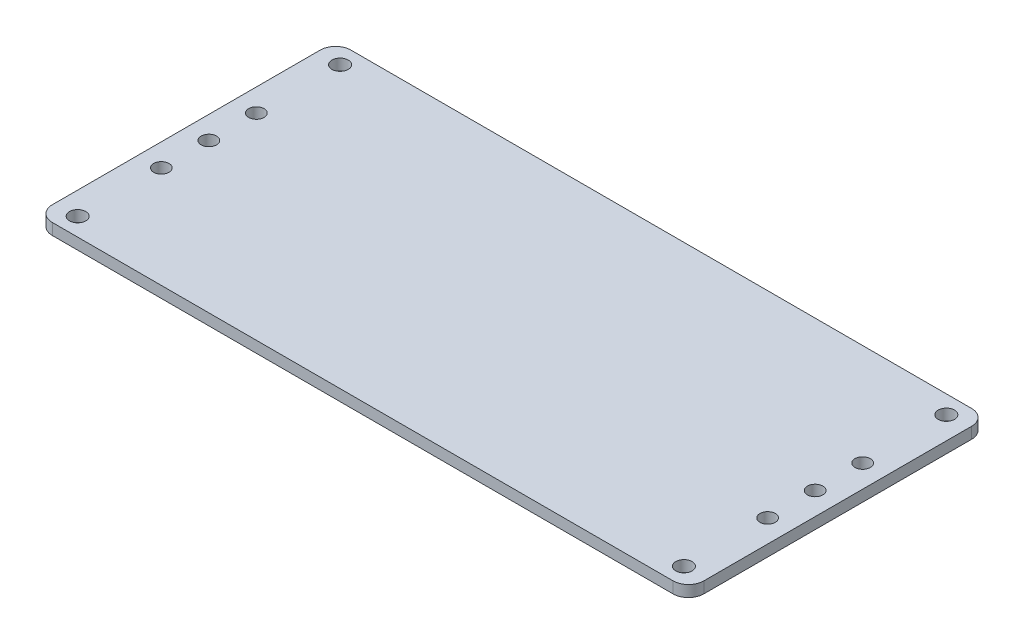
ISO-10303-21;
HEADER;
FILE_DESCRIPTION(('STEP AP214'),'2;1');
FILE_NAME('part.step','',(''),(''),'','','');
FILE_SCHEMA(('AUTOMOTIVE_DESIGN { 1 0 10303 214 1 1 1 1 }'));
ENDSEC;
DATA;
#1=APPLICATION_CONTEXT('core data for automotive mechanical design processes');
#2=APPLICATION_PROTOCOL_DEFINITION('international standard','automotive_design',2000,#1);
#3=PRODUCT_CONTEXT('',#1,'mechanical');
#4=PRODUCT('Part','Part','',(#3));
#5=PRODUCT_RELATED_PRODUCT_CATEGORY('part','',(#4));
#6=PRODUCT_DEFINITION_FORMATION('','',#4);
#7=PRODUCT_DEFINITION_CONTEXT('part definition',#1,'design');
#8=PRODUCT_DEFINITION('design','',#6,#7);
#9=PRODUCT_DEFINITION_SHAPE('','',#8);
#10=(LENGTH_UNIT() NAMED_UNIT(*) SI_UNIT(.MILLI.,.METRE.));
#11=(NAMED_UNIT(*) PLANE_ANGLE_UNIT() SI_UNIT($,.RADIAN.));
#12=(NAMED_UNIT(*) SI_UNIT($,.STERADIAN.) SOLID_ANGLE_UNIT());
#13=UNCERTAINTY_MEASURE_WITH_UNIT(LENGTH_MEASURE(1.E-05),#10,'distance_accuracy_value','');
#14=(GEOMETRIC_REPRESENTATION_CONTEXT(3) GLOBAL_UNCERTAINTY_ASSIGNED_CONTEXT((#13)) GLOBAL_UNIT_ASSIGNED_CONTEXT((#10,
#11,#12)) REPRESENTATION_CONTEXT('',''));
#15=CARTESIAN_POINT('',(0.,0.,0.));
#16=DIRECTION('',(0.,0.,1.));
#17=DIRECTION('',(1.,0.,0.));
#18=AXIS2_PLACEMENT_3D('',#15,#16,#17);
#19=CARTESIAN_POINT('',(0.,2.5,0.));
#20=DIRECTION('',(0.,1.,0.));
#21=DIRECTION('',(0.,0.,1.));
#22=AXIS2_PLACEMENT_3D('',#19,#20,#21);
#23=PLANE('',#22);
#24=CARTESIAN_POINT('',(67.,2.5,-10.5));
#25=DIRECTION('',(0.,1.,0.));
#26=DIRECTION('',(0.,0.,1.));
#27=AXIS2_PLACEMENT_3D('',#24,#25,#26);
#28=CIRCLE('',#27,1.7);
#29=CARTESIAN_POINT('',(67.,2.5,-8.8));
#30=VERTEX_POINT('',#29);
#31=EDGE_CURVE('E259',#30,#30,#28,.T.);
#32=ORIENTED_EDGE('',*,*,#31,.F.);
#33=EDGE_LOOP('',(#32));
#34=FACE_BOUND('',#33,.T.);
#35=CARTESIAN_POINT('',(-67.,2.5,10.5));
#36=DIRECTION('',(0.,1.,0.));
#37=DIRECTION('',(0.,0.,1.));
#38=AXIS2_PLACEMENT_3D('',#35,#36,#37);
#39=CIRCLE('',#38,1.7);
#40=CARTESIAN_POINT('',(-67.,2.5,12.2));
#41=VERTEX_POINT('',#40);
#42=EDGE_CURVE('E243',#41,#41,#39,.T.);
#43=ORIENTED_EDGE('',*,*,#42,.F.);
#44=EDGE_LOOP('',(#43));
#45=FACE_BOUND('',#44,.T.);
#46=CARTESIAN_POINT('',(-67.,2.5,0.));
#47=DIRECTION('',(0.,1.,0.));
#48=DIRECTION('',(0.,0.,1.));
#49=AXIS2_PLACEMENT_3D('',#46,#47,#48);
#50=CIRCLE('',#49,1.7);
#51=CARTESIAN_POINT('',(-67.,2.5,1.7));
#52=VERTEX_POINT('',#51);
#53=EDGE_CURVE('E227',#52,#52,#50,.T.);
#54=ORIENTED_EDGE('',*,*,#53,.F.);
#55=EDGE_LOOP('',(#54));
#56=FACE_BOUND('',#55,.T.);
#57=CARTESIAN_POINT('',(-67.,2.5,29.));
#58=DIRECTION('',(0.,1.,0.));
#59=DIRECTION('',(0.,0.,1.));
#60=AXIS2_PLACEMENT_3D('',#57,#58,#59);
#61=CIRCLE('',#60,1.79999999999999);
#62=CARTESIAN_POINT('',(-67.,2.5,30.8));
#63=VERTEX_POINT('',#62);
#64=EDGE_CURVE('E211',#63,#63,#61,.T.);
#65=ORIENTED_EDGE('',*,*,#64,.F.);
#66=EDGE_LOOP('',(#65));
#67=FACE_BOUND('',#66,.T.);
#68=CARTESIAN_POINT('',(-67.,2.5,-29.));
#69=DIRECTION('',(0.,1.,0.));
#70=DIRECTION('',(0.,0.,1.));
#71=AXIS2_PLACEMENT_3D('',#68,#69,#70);
#72=CIRCLE('',#71,1.79999999999999);
#73=CARTESIAN_POINT('',(-67.,2.5,-27.2));
#74=VERTEX_POINT('',#73);
#75=EDGE_CURVE('E141',#74,#74,#72,.T.);
#76=ORIENTED_EDGE('',*,*,#75,.F.);
#77=EDGE_LOOP('',(#76));
#78=FACE_BOUND('',#77,.T.);
#79=DIRECTION('',(1.,0.,0.));
#80=VECTOR('',#79,1.);
#81=CARTESIAN_POINT('',(-72.,2.5,33.));
#82=LINE('',#81,#80);
#83=CARTESIAN_POINT('',(-68.6,2.5,33.));
#84=VERTEX_POINT('',#83);
#85=CARTESIAN_POINT('',(68.6,2.5,33.));
#86=VERTEX_POINT('',#85);
#87=EDGE_CURVE('E152',#84,#86,#82,.T.);
#88=ORIENTED_EDGE('',*,*,#87,.T.);
#89=CARTESIAN_POINT('',(68.6,2.5,29.6));
#90=DIRECTION('',(0.,1.,0.));
#91=DIRECTION('',(0.,0.,1.));
#92=AXIS2_PLACEMENT_3D('',#89,#90,#91);
#93=CIRCLE('',#92,3.4);
#94=CARTESIAN_POINT('',(72.,2.5,29.6));
#95=VERTEX_POINT('',#94);
#96=EDGE_CURVE('E182',#86,#95,#93,.T.);
#97=ORIENTED_EDGE('',*,*,#96,.T.);
#98=DIRECTION('',(0.,0.,-1.));
#99=VECTOR('',#98,1.);
#100=CARTESIAN_POINT('',(72.,2.5,-33.));
#101=LINE('',#100,#99);
#102=CARTESIAN_POINT('',(72.,2.5,-29.6));
#103=VERTEX_POINT('',#102);
#104=EDGE_CURVE('E131',#95,#103,#101,.T.);
#105=ORIENTED_EDGE('',*,*,#104,.T.);
#106=CARTESIAN_POINT('',(68.6,2.5,-29.6));
#107=DIRECTION('',(0.,1.,0.));
#108=DIRECTION('',(0.,0.,1.));
#109=AXIS2_PLACEMENT_3D('',#106,#107,#108);
#110=CIRCLE('',#109,3.4);
#111=CARTESIAN_POINT('',(68.6,2.5,-33.));
#112=VERTEX_POINT('',#111);
#113=EDGE_CURVE('E179',#103,#112,#110,.T.);
#114=ORIENTED_EDGE('',*,*,#113,.T.);
#115=DIRECTION('',(-1.,0.,0.));
#116=VECTOR('',#115,1.);
#117=CARTESIAN_POINT('',(-72.,2.5,-33.));
#118=LINE('',#117,#116);
#119=CARTESIAN_POINT('',(-68.6,2.5,-33.));
#120=VERTEX_POINT('',#119);
#121=EDGE_CURVE('E197',#112,#120,#118,.T.);
#122=ORIENTED_EDGE('',*,*,#121,.T.);
#123=CARTESIAN_POINT('',(-68.6,2.5,-29.6));
#124=DIRECTION('',(0.,1.,0.));
#125=DIRECTION('',(0.,0.,1.));
#126=AXIS2_PLACEMENT_3D('',#123,#124,#125);
#127=CIRCLE('',#126,3.4);
#128=CARTESIAN_POINT('',(-72.,2.5,-29.6));
#129=VERTEX_POINT('',#128);
#130=EDGE_CURVE('E65',#120,#129,#127,.T.);
#131=ORIENTED_EDGE('',*,*,#130,.T.);
#132=DIRECTION('',(0.,0.,1.));
#133=VECTOR('',#132,1.);
#134=CARTESIAN_POINT('',(-72.,2.5,-33.));
#135=LINE('',#134,#133);
#136=CARTESIAN_POINT('',(-72.,2.5,29.6));
#137=VERTEX_POINT('',#136);
#138=EDGE_CURVE('E195',#129,#137,#135,.T.);
#139=ORIENTED_EDGE('',*,*,#138,.T.);
#140=CARTESIAN_POINT('',(-68.6,2.5,29.6));
#141=DIRECTION('',(0.,1.,0.));
#142=DIRECTION('',(0.,0.,1.));
#143=AXIS2_PLACEMENT_3D('',#140,#141,#142);
#144=CIRCLE('',#143,3.4);
#145=EDGE_CURVE('E174',#137,#84,#144,.T.);
#146=ORIENTED_EDGE('',*,*,#145,.T.);
#147=EDGE_LOOP('',(#88,#97,#105,#114,#122,#131,#139,#146));
#148=FACE_BOUND('',#147,.T.);
#149=CARTESIAN_POINT('',(67.,2.5,-29.));
#150=DIRECTION('',(0.,1.,0.));
#151=DIRECTION('',(0.,0.,1.));
#152=AXIS2_PLACEMENT_3D('',#149,#150,#151);
#153=CIRCLE('',#152,1.79999999999999);
#154=CARTESIAN_POINT('',(67.,2.5,-27.2));
#155=VERTEX_POINT('',#154);
#156=EDGE_CURVE('E205',#155,#155,#153,.T.);
#157=ORIENTED_EDGE('',*,*,#156,.F.);
#158=EDGE_LOOP('',(#157));
#159=FACE_BOUND('',#158,.T.);
#160=CARTESIAN_POINT('',(67.,2.5,29.));
#161=DIRECTION('',(0.,1.,0.));
#162=DIRECTION('',(0.,0.,1.));
#163=AXIS2_PLACEMENT_3D('',#160,#161,#162);
#164=CIRCLE('',#163,1.79999999999999);
#165=CARTESIAN_POINT('',(67.,2.5,30.8));
#166=VERTEX_POINT('',#165);
#167=EDGE_CURVE('E219',#166,#166,#164,.T.);
#168=ORIENTED_EDGE('',*,*,#167,.F.);
#169=EDGE_LOOP('',(#168));
#170=FACE_BOUND('',#169,.T.);
#171=CARTESIAN_POINT('',(-67.,2.5,-10.5));
#172=DIRECTION('',(0.,1.,0.));
#173=DIRECTION('',(0.,0.,1.));
#174=AXIS2_PLACEMENT_3D('',#171,#172,#173);
#175=CIRCLE('',#174,1.7);
#176=CARTESIAN_POINT('',(-67.,2.5,-8.8));
#177=VERTEX_POINT('',#176);
#178=EDGE_CURVE('E235',#177,#177,#175,.T.);
#179=ORIENTED_EDGE('',*,*,#178,.F.);
#180=EDGE_LOOP('',(#179));
#181=FACE_BOUND('',#180,.T.);
#182=CARTESIAN_POINT('',(67.,2.5,0.));
#183=DIRECTION('',(0.,1.,0.));
#184=DIRECTION('',(0.,0.,1.));
#185=AXIS2_PLACEMENT_3D('',#182,#183,#184);
#186=CIRCLE('',#185,1.7);
#187=CARTESIAN_POINT('',(67.,2.5,1.7));
#188=VERTEX_POINT('',#187);
#189=EDGE_CURVE('E251',#188,#188,#186,.T.);
#190=ORIENTED_EDGE('',*,*,#189,.F.);
#191=EDGE_LOOP('',(#190));
#192=FACE_BOUND('',#191,.T.);
#193=CARTESIAN_POINT('',(67.,2.5,10.5));
#194=DIRECTION('',(0.,1.,0.));
#195=DIRECTION('',(0.,0.,1.));
#196=AXIS2_PLACEMENT_3D('',#193,#194,#195);
#197=CIRCLE('',#196,1.7);
#198=CARTESIAN_POINT('',(67.,2.5,12.2));
#199=VERTEX_POINT('',#198);
#200=EDGE_CURVE('E267',#199,#199,#197,.T.);
#201=ORIENTED_EDGE('',*,*,#200,.F.);
#202=EDGE_LOOP('',(#201));
#203=FACE_BOUND('',#202,.T.);
#204=ADVANCED_FACE('F43',(#34,#45,#56,#67,#78,#148,#159,#170,#181,#192,#203),#23,.T.);
#205=CARTESIAN_POINT('',(0.,0.,0.));
#206=DIRECTION('',(0.,1.,0.));
#207=DIRECTION('',(0.,0.,1.));
#208=AXIS2_PLACEMENT_3D('',#205,#206,#207);
#209=PLANE('',#208);
#210=DIRECTION('',(0.,0.,-1.));
#211=VECTOR('',#210,1.);
#212=CARTESIAN_POINT('',(72.,0.,-33.));
#213=LINE('',#212,#211);
#214=CARTESIAN_POINT('',(72.,0.,29.6));
#215=VERTEX_POINT('',#214);
#216=CARTESIAN_POINT('',(72.,0.,-29.6));
#217=VERTEX_POINT('',#216);
#218=EDGE_CURVE('E128',#215,#217,#213,.T.);
#219=ORIENTED_EDGE('',*,*,#218,.F.);
#220=CARTESIAN_POINT('',(68.6,0.,29.6));
#221=DIRECTION('',(0.,1.,0.));
#222=DIRECTION('',(0.,0.,1.));
#223=AXIS2_PLACEMENT_3D('',#220,#221,#222);
#224=CIRCLE('',#223,3.4);
#225=CARTESIAN_POINT('',(68.6,0.,33.));
#226=VERTEX_POINT('',#225);
#227=EDGE_CURVE('E110',#215,#226,#224,.F.);
#228=ORIENTED_EDGE('',*,*,#227,.T.);
#229=DIRECTION('',(1.,0.,0.));
#230=VECTOR('',#229,1.);
#231=CARTESIAN_POINT('',(-72.,0.,33.));
#232=LINE('',#231,#230);
#233=CARTESIAN_POINT('',(-68.6,0.,33.));
#234=VERTEX_POINT('',#233);
#235=EDGE_CURVE('E157',#234,#226,#232,.T.);
#236=ORIENTED_EDGE('',*,*,#235,.F.);
#237=CARTESIAN_POINT('',(-68.6,0.,29.6));
#238=DIRECTION('',(0.,1.,0.));
#239=DIRECTION('',(0.,0.,1.));
#240=AXIS2_PLACEMENT_3D('',#237,#238,#239);
#241=CIRCLE('',#240,3.4);
#242=CARTESIAN_POINT('',(-72.,0.,29.6));
#243=VERTEX_POINT('',#242);
#244=EDGE_CURVE('E133',#234,#243,#241,.F.);
#245=ORIENTED_EDGE('',*,*,#244,.T.);
#246=DIRECTION('',(0.,0.,1.));
#247=VECTOR('',#246,1.);
#248=CARTESIAN_POINT('',(-72.,0.,-33.));
#249=LINE('',#248,#247);
#250=CARTESIAN_POINT('',(-72.,0.,-29.6));
#251=VERTEX_POINT('',#250);
#252=EDGE_CURVE('E146',#251,#243,#249,.T.);
#253=ORIENTED_EDGE('',*,*,#252,.F.);
#254=CARTESIAN_POINT('',(-68.6,0.,-29.6));
#255=DIRECTION('',(0.,1.,0.));
#256=DIRECTION('',(0.,0.,1.));
#257=AXIS2_PLACEMENT_3D('',#254,#255,#256);
#258=CIRCLE('',#257,3.4);
#259=CARTESIAN_POINT('',(-68.6,0.,-33.));
#260=VERTEX_POINT('',#259);
#261=EDGE_CURVE('E164',#251,#260,#258,.F.);
#262=ORIENTED_EDGE('',*,*,#261,.T.);
#263=DIRECTION('',(-1.,0.,0.));
#264=VECTOR('',#263,1.);
#265=CARTESIAN_POINT('',(-72.,0.,-33.));
#266=LINE('',#265,#264);
#267=CARTESIAN_POINT('',(68.6,0.,-33.));
#268=VERTEX_POINT('',#267);
#269=EDGE_CURVE('E140',#268,#260,#266,.T.);
#270=ORIENTED_EDGE('',*,*,#269,.F.);
#271=CARTESIAN_POINT('',(68.6,0.,-29.6));
#272=DIRECTION('',(0.,1.,0.));
#273=DIRECTION('',(0.,0.,1.));
#274=AXIS2_PLACEMENT_3D('',#271,#272,#273);
#275=CIRCLE('',#274,3.4);
#276=EDGE_CURVE('E122',#268,#217,#275,.F.);
#277=ORIENTED_EDGE('',*,*,#276,.T.);
#278=EDGE_LOOP('',(#219,#228,#236,#245,#253,#262,#270,#277));
#279=FACE_BOUND('',#278,.T.);
#280=CARTESIAN_POINT('',(-67.,0.,-29.));
#281=DIRECTION('',(0.,1.,0.));
#282=DIRECTION('',(0.,0.,1.));
#283=AXIS2_PLACEMENT_3D('',#280,#281,#282);
#284=CIRCLE('',#283,1.79999999999999);
#285=CARTESIAN_POINT('',(-67.,0.,-27.2));
#286=VERTEX_POINT('',#285);
#287=EDGE_CURVE('E149',#286,#286,#284,.T.);
#288=ORIENTED_EDGE('',*,*,#287,.T.);
#289=EDGE_LOOP('',(#288));
#290=FACE_BOUND('',#289,.T.);
#291=CARTESIAN_POINT('',(67.,0.,-29.));
#292=DIRECTION('',(0.,1.,0.));
#293=DIRECTION('',(0.,0.,1.));
#294=AXIS2_PLACEMENT_3D('',#291,#292,#293);
#295=CIRCLE('',#294,1.79999999999999);
#296=CARTESIAN_POINT('',(67.,0.,-27.2));
#297=VERTEX_POINT('',#296);
#298=EDGE_CURVE('E207',#297,#297,#295,.T.);
#299=ORIENTED_EDGE('',*,*,#298,.T.);
#300=EDGE_LOOP('',(#299));
#301=FACE_BOUND('',#300,.T.);
#302=CARTESIAN_POINT('',(-67.,0.,29.));
#303=DIRECTION('',(0.,1.,0.));
#304=DIRECTION('',(0.,0.,1.));
#305=AXIS2_PLACEMENT_3D('',#302,#303,#304);
#306=CIRCLE('',#305,1.79999999999999);
#307=CARTESIAN_POINT('',(-67.,0.,30.8));
#308=VERTEX_POINT('',#307);
#309=EDGE_CURVE('E215',#308,#308,#306,.T.);
#310=ORIENTED_EDGE('',*,*,#309,.T.);
#311=EDGE_LOOP('',(#310));
#312=FACE_BOUND('',#311,.T.);
#313=CARTESIAN_POINT('',(67.,0.,29.));
#314=DIRECTION('',(0.,1.,0.));
#315=DIRECTION('',(0.,0.,1.));
#316=AXIS2_PLACEMENT_3D('',#313,#314,#315);
#317=CIRCLE('',#316,1.79999999999999);
#318=CARTESIAN_POINT('',(67.,0.,30.8));
#319=VERTEX_POINT('',#318);
#320=EDGE_CURVE('E223',#319,#319,#317,.T.);
#321=ORIENTED_EDGE('',*,*,#320,.T.);
#322=EDGE_LOOP('',(#321));
#323=FACE_BOUND('',#322,.T.);
#324=CARTESIAN_POINT('',(-67.,0.,0.));
#325=DIRECTION('',(0.,1.,0.));
#326=DIRECTION('',(0.,0.,1.));
#327=AXIS2_PLACEMENT_3D('',#324,#325,#326);
#328=CIRCLE('',#327,1.7);
#329=CARTESIAN_POINT('',(-67.,0.,1.7));
#330=VERTEX_POINT('',#329);
#331=EDGE_CURVE('E231',#330,#330,#328,.T.);
#332=ORIENTED_EDGE('',*,*,#331,.T.);
#333=EDGE_LOOP('',(#332));
#334=FACE_BOUND('',#333,.T.);
#335=CARTESIAN_POINT('',(-67.,0.,-10.5));
#336=DIRECTION('',(0.,1.,0.));
#337=DIRECTION('',(0.,0.,1.));
#338=AXIS2_PLACEMENT_3D('',#335,#336,#337);
#339=CIRCLE('',#338,1.7);
#340=CARTESIAN_POINT('',(-67.,0.,-8.8));
#341=VERTEX_POINT('',#340);
#342=EDGE_CURVE('E239',#341,#341,#339,.T.);
#343=ORIENTED_EDGE('',*,*,#342,.T.);
#344=EDGE_LOOP('',(#343));
#345=FACE_BOUND('',#344,.T.);
#346=CARTESIAN_POINT('',(-67.,0.,10.5));
#347=DIRECTION('',(0.,1.,0.));
#348=DIRECTION('',(0.,0.,1.));
#349=AXIS2_PLACEMENT_3D('',#346,#347,#348);
#350=CIRCLE('',#349,1.7);
#351=CARTESIAN_POINT('',(-67.,0.,12.2));
#352=VERTEX_POINT('',#351);
#353=EDGE_CURVE('E247',#352,#352,#350,.T.);
#354=ORIENTED_EDGE('',*,*,#353,.T.);
#355=EDGE_LOOP('',(#354));
#356=FACE_BOUND('',#355,.T.);
#357=CARTESIAN_POINT('',(67.,0.,0.));
#358=DIRECTION('',(0.,1.,0.));
#359=DIRECTION('',(0.,0.,1.));
#360=AXIS2_PLACEMENT_3D('',#357,#358,#359);
#361=CIRCLE('',#360,1.7);
#362=CARTESIAN_POINT('',(67.,0.,1.7));
#363=VERTEX_POINT('',#362);
#364=EDGE_CURVE('E255',#363,#363,#361,.T.);
#365=ORIENTED_EDGE('',*,*,#364,.T.);
#366=EDGE_LOOP('',(#365));
#367=FACE_BOUND('',#366,.T.);
#368=CARTESIAN_POINT('',(67.,0.,-10.5));
#369=DIRECTION('',(0.,1.,0.));
#370=DIRECTION('',(0.,0.,1.));
#371=AXIS2_PLACEMENT_3D('',#368,#369,#370);
#372=CIRCLE('',#371,1.7);
#373=CARTESIAN_POINT('',(67.,0.,-8.8));
#374=VERTEX_POINT('',#373);
#375=EDGE_CURVE('E263',#374,#374,#372,.T.);
#376=ORIENTED_EDGE('',*,*,#375,.T.);
#377=EDGE_LOOP('',(#376));
#378=FACE_BOUND('',#377,.T.);
#379=CARTESIAN_POINT('',(67.,0.,10.5));
#380=DIRECTION('',(0.,1.,0.));
#381=DIRECTION('',(0.,0.,1.));
#382=AXIS2_PLACEMENT_3D('',#379,#380,#381);
#383=CIRCLE('',#382,1.7);
#384=CARTESIAN_POINT('',(67.,0.,12.2));
#385=VERTEX_POINT('',#384);
#386=EDGE_CURVE('E271',#385,#385,#383,.T.);
#387=ORIENTED_EDGE('',*,*,#386,.T.);
#388=EDGE_LOOP('',(#387));
#389=FACE_BOUND('',#388,.T.);
#390=ADVANCED_FACE('F136',(#279,#290,#301,#312,#323,#334,#345,#356,#367,#378,#389),#209,.F.);
#391=CARTESIAN_POINT('',(72.,2.5,-33.));
#392=DIRECTION('',(-1.,0.,0.));
#393=DIRECTION('',(0.,0.,1.));
#394=AXIS2_PLACEMENT_3D('',#391,#392,#393);
#395=PLANE('',#394);
#396=ORIENTED_EDGE('',*,*,#104,.F.);
#397=DIRECTION('',(0.,-1.,0.));
#398=VECTOR('',#397,1.);
#399=CARTESIAN_POINT('',(72.,2.5,29.6));
#400=LINE('',#399,#398);
#401=EDGE_CURVE('E114',#95,#215,#400,.T.);
#402=ORIENTED_EDGE('',*,*,#401,.T.);
#403=ORIENTED_EDGE('',*,*,#218,.T.);
#404=DIRECTION('',(0.,-1.,0.));
#405=VECTOR('',#404,1.);
#406=CARTESIAN_POINT('',(72.,2.5,-29.6));
#407=LINE('',#406,#405);
#408=EDGE_CURVE('E134',#217,#103,#407,.F.);
#409=ORIENTED_EDGE('',*,*,#408,.T.);
#410=EDGE_LOOP('',(#396,#402,#403,#409));
#411=FACE_BOUND('',#410,.T.);
#412=ADVANCED_FACE('F127',(#411),#395,.F.);
#413=CARTESIAN_POINT('',(-72.,2.5,-33.));
#414=DIRECTION('',(0.,0.,1.));
#415=DIRECTION('',(1.,0.,0.));
#416=AXIS2_PLACEMENT_3D('',#413,#414,#415);
#417=PLANE('',#416);
#418=ORIENTED_EDGE('',*,*,#121,.F.);
#419=DIRECTION('',(0.,-1.,0.));
#420=VECTOR('',#419,1.);
#421=CARTESIAN_POINT('',(68.6,2.5,-33.));
#422=LINE('',#421,#420);
#423=EDGE_CURVE('E188',#112,#268,#422,.T.);
#424=ORIENTED_EDGE('',*,*,#423,.T.);
#425=ORIENTED_EDGE('',*,*,#269,.T.);
#426=DIRECTION('',(0.,-1.,0.));
#427=VECTOR('',#426,1.);
#428=CARTESIAN_POINT('',(-68.6,2.5,-33.));
#429=LINE('',#428,#427);
#430=EDGE_CURVE('E185',#260,#120,#429,.F.);
#431=ORIENTED_EDGE('',*,*,#430,.T.);
#432=EDGE_LOOP('',(#418,#424,#425,#431));
#433=FACE_BOUND('',#432,.T.);
#434=ADVANCED_FACE('F302',(#433),#417,.F.);
#435=CARTESIAN_POINT('',(-72.,2.5,-33.));
#436=DIRECTION('',(1.,0.,0.));
#437=DIRECTION('',(0.,0.,-1.));
#438=AXIS2_PLACEMENT_3D('',#435,#436,#437);
#439=PLANE('',#438);
#440=ORIENTED_EDGE('',*,*,#138,.F.);
#441=DIRECTION('',(0.,-1.,0.));
#442=VECTOR('',#441,1.);
#443=CARTESIAN_POINT('',(-72.,2.5,-29.6));
#444=LINE('',#443,#442);
#445=EDGE_CURVE('E11',#129,#251,#444,.T.);
#446=ORIENTED_EDGE('',*,*,#445,.T.);
#447=ORIENTED_EDGE('',*,*,#252,.T.);
#448=DIRECTION('',(0.,-1.,0.));
#449=VECTOR('',#448,1.);
#450=CARTESIAN_POINT('',(-72.,2.5,29.6));
#451=LINE('',#450,#449);
#452=EDGE_CURVE('E52',#243,#137,#451,.F.);
#453=ORIENTED_EDGE('',*,*,#452,.T.);
#454=EDGE_LOOP('',(#440,#446,#447,#453));
#455=FACE_BOUND('',#454,.T.);
#456=ADVANCED_FACE('F298',(#455),#439,.F.);
#457=CARTESIAN_POINT('',(-72.,2.5,33.));
#458=DIRECTION('',(0.,0.,-1.));
#459=DIRECTION('',(-1.,0.,0.));
#460=AXIS2_PLACEMENT_3D('',#457,#458,#459);
#461=PLANE('',#460);
#462=ORIENTED_EDGE('',*,*,#235,.T.);
#463=DIRECTION('',(0.,-1.,0.));
#464=VECTOR('',#463,1.);
#465=CARTESIAN_POINT('',(68.6,2.5,33.));
#466=LINE('',#465,#464);
#467=EDGE_CURVE('E115',#226,#86,#466,.F.);
#468=ORIENTED_EDGE('',*,*,#467,.T.);
#469=ORIENTED_EDGE('',*,*,#87,.F.);
#470=DIRECTION('',(0.,-1.,0.));
#471=VECTOR('',#470,1.);
#472=CARTESIAN_POINT('',(-68.6,2.5,33.));
#473=LINE('',#472,#471);
#474=EDGE_CURVE('E121',#84,#234,#473,.T.);
#475=ORIENTED_EDGE('',*,*,#474,.T.);
#476=EDGE_LOOP('',(#462,#468,#469,#475));
#477=FACE_BOUND('',#476,.T.);
#478=ADVANCED_FACE('F295',(#477),#461,.F.);
#479=CARTESIAN_POINT('',(-67.,2.5,-29.));
#480=DIRECTION('',(0.,-1.,0.));
#481=DIRECTION('',(0.,0.,-1.));
#482=AXIS2_PLACEMENT_3D('',#479,#480,#481);
#483=CYLINDRICAL_SURFACE('',#482,1.79999999999999);
#484=ORIENTED_EDGE('',*,*,#75,.T.);
#485=EDGE_LOOP('',(#484));
#486=FACE_BOUND('',#485,.T.);
#487=ORIENTED_EDGE('',*,*,#287,.F.);
#488=EDGE_LOOP('',(#487));
#489=FACE_BOUND('',#488,.T.);
#490=ADVANCED_FACE('F292',(#486,#489),#483,.F.);
#491=CARTESIAN_POINT('',(67.,2.5,-29.));
#492=DIRECTION('',(0.,-1.,0.));
#493=DIRECTION('',(0.,0.,-1.));
#494=AXIS2_PLACEMENT_3D('',#491,#492,#493);
#495=CYLINDRICAL_SURFACE('',#494,1.79999999999999);
#496=ORIENTED_EDGE('',*,*,#156,.T.);
#497=EDGE_LOOP('',(#496));
#498=FACE_BOUND('',#497,.T.);
#499=ORIENTED_EDGE('',*,*,#298,.F.);
#500=EDGE_LOOP('',(#499));
#501=FACE_BOUND('',#500,.T.);
#502=ADVANCED_FACE('F372',(#498,#501),#495,.F.);
#503=CARTESIAN_POINT('',(-67.,2.5,29.));
#504=DIRECTION('',(0.,-1.,0.));
#505=DIRECTION('',(0.,0.,-1.));
#506=AXIS2_PLACEMENT_3D('',#503,#504,#505);
#507=CYLINDRICAL_SURFACE('',#506,1.79999999999999);
#508=ORIENTED_EDGE('',*,*,#64,.T.);
#509=EDGE_LOOP('',(#508));
#510=FACE_BOUND('',#509,.T.);
#511=ORIENTED_EDGE('',*,*,#309,.F.);
#512=EDGE_LOOP('',(#511));
#513=FACE_BOUND('',#512,.T.);
#514=ADVANCED_FACE('F369',(#510,#513),#507,.F.);
#515=CARTESIAN_POINT('',(67.,2.5,29.));
#516=DIRECTION('',(0.,-1.,0.));
#517=DIRECTION('',(0.,0.,-1.));
#518=AXIS2_PLACEMENT_3D('',#515,#516,#517);
#519=CYLINDRICAL_SURFACE('',#518,1.79999999999999);
#520=ORIENTED_EDGE('',*,*,#167,.T.);
#521=EDGE_LOOP('',(#520));
#522=FACE_BOUND('',#521,.T.);
#523=ORIENTED_EDGE('',*,*,#320,.F.);
#524=EDGE_LOOP('',(#523));
#525=FACE_BOUND('',#524,.T.);
#526=ADVANCED_FACE('F365',(#522,#525),#519,.F.);
#527=CARTESIAN_POINT('',(-67.,2.5,0.));
#528=DIRECTION('',(0.,-1.,0.));
#529=DIRECTION('',(0.,0.,-1.));
#530=AXIS2_PLACEMENT_3D('',#527,#528,#529);
#531=CYLINDRICAL_SURFACE('',#530,1.7);
#532=ORIENTED_EDGE('',*,*,#53,.T.);
#533=EDGE_LOOP('',(#532));
#534=FACE_BOUND('',#533,.T.);
#535=ORIENTED_EDGE('',*,*,#331,.F.);
#536=EDGE_LOOP('',(#535));
#537=FACE_BOUND('',#536,.T.);
#538=ADVANCED_FACE('F361',(#534,#537),#531,.F.);
#539=CARTESIAN_POINT('',(-67.,2.5,-10.5));
#540=DIRECTION('',(0.,-1.,0.));
#541=DIRECTION('',(0.,0.,-1.));
#542=AXIS2_PLACEMENT_3D('',#539,#540,#541);
#543=CYLINDRICAL_SURFACE('',#542,1.7);
#544=ORIENTED_EDGE('',*,*,#178,.T.);
#545=EDGE_LOOP('',(#544));
#546=FACE_BOUND('',#545,.T.);
#547=ORIENTED_EDGE('',*,*,#342,.F.);
#548=EDGE_LOOP('',(#547));
#549=FACE_BOUND('',#548,.T.);
#550=ADVANCED_FACE('F357',(#546,#549),#543,.F.);
#551=CARTESIAN_POINT('',(-67.,2.5,10.5));
#552=DIRECTION('',(0.,-1.,0.));
#553=DIRECTION('',(0.,0.,-1.));
#554=AXIS2_PLACEMENT_3D('',#551,#552,#553);
#555=CYLINDRICAL_SURFACE('',#554,1.7);
#556=ORIENTED_EDGE('',*,*,#42,.T.);
#557=EDGE_LOOP('',(#556));
#558=FACE_BOUND('',#557,.T.);
#559=ORIENTED_EDGE('',*,*,#353,.F.);
#560=EDGE_LOOP('',(#559));
#561=FACE_BOUND('',#560,.T.);
#562=ADVANCED_FACE('F339',(#558,#561),#555,.F.);
#563=CARTESIAN_POINT('',(67.,2.5,0.));
#564=DIRECTION('',(0.,-1.,0.));
#565=DIRECTION('',(0.,0.,-1.));
#566=AXIS2_PLACEMENT_3D('',#563,#564,#565);
#567=CYLINDRICAL_SURFACE('',#566,1.7);
#568=ORIENTED_EDGE('',*,*,#189,.T.);
#569=EDGE_LOOP('',(#568));
#570=FACE_BOUND('',#569,.T.);
#571=ORIENTED_EDGE('',*,*,#364,.F.);
#572=EDGE_LOOP('',(#571));
#573=FACE_BOUND('',#572,.T.);
#574=ADVANCED_FACE('F335',(#570,#573),#567,.F.);
#575=CARTESIAN_POINT('',(67.,2.5,-10.5));
#576=DIRECTION('',(0.,-1.,0.));
#577=DIRECTION('',(0.,0.,-1.));
#578=AXIS2_PLACEMENT_3D('',#575,#576,#577);
#579=CYLINDRICAL_SURFACE('',#578,1.7);
#580=ORIENTED_EDGE('',*,*,#31,.T.);
#581=EDGE_LOOP('',(#580));
#582=FACE_BOUND('',#581,.T.);
#583=ORIENTED_EDGE('',*,*,#375,.F.);
#584=EDGE_LOOP('',(#583));
#585=FACE_BOUND('',#584,.T.);
#586=ADVANCED_FACE('F338',(#582,#585),#579,.F.);
#587=CARTESIAN_POINT('',(67.,2.5,10.5));
#588=DIRECTION('',(0.,-1.,0.));
#589=DIRECTION('',(0.,0.,-1.));
#590=AXIS2_PLACEMENT_3D('',#587,#588,#589);
#591=CYLINDRICAL_SURFACE('',#590,1.7);
#592=ORIENTED_EDGE('',*,*,#200,.T.);
#593=EDGE_LOOP('',(#592));
#594=FACE_BOUND('',#593,.T.);
#595=ORIENTED_EDGE('',*,*,#386,.F.);
#596=EDGE_LOOP('',(#595));
#597=FACE_BOUND('',#596,.T.);
#598=ADVANCED_FACE('F279',(#594,#597),#591,.F.);
#599=CARTESIAN_POINT('',(68.6,2.5,29.6));
#600=DIRECTION('',(0.,-1.,0.));
#601=DIRECTION('',(0.,0.,-1.));
#602=AXIS2_PLACEMENT_3D('',#599,#600,#601);
#603=CYLINDRICAL_SURFACE('',#602,3.4);
#604=ORIENTED_EDGE('',*,*,#96,.F.);
#605=ORIENTED_EDGE('',*,*,#467,.F.);
#606=ORIENTED_EDGE('',*,*,#227,.F.);
#607=ORIENTED_EDGE('',*,*,#401,.F.);
#608=EDGE_LOOP('',(#604,#605,#606,#607));
#609=FACE_BOUND('',#608,.T.);
#610=ADVANCED_FACE('F113',(#609),#603,.T.);
#611=CARTESIAN_POINT('',(68.6,2.5,-29.6));
#612=DIRECTION('',(0.,-1.,0.));
#613=DIRECTION('',(0.,0.,-1.));
#614=AXIS2_PLACEMENT_3D('',#611,#612,#613);
#615=CYLINDRICAL_SURFACE('',#614,3.4);
#616=ORIENTED_EDGE('',*,*,#113,.F.);
#617=ORIENTED_EDGE('',*,*,#408,.F.);
#618=ORIENTED_EDGE('',*,*,#276,.F.);
#619=ORIENTED_EDGE('',*,*,#423,.F.);
#620=EDGE_LOOP('',(#616,#617,#618,#619));
#621=FACE_BOUND('',#620,.T.);
#622=ADVANCED_FACE('F310',(#621),#615,.T.);
#623=CARTESIAN_POINT('',(-68.6,2.5,-29.6));
#624=DIRECTION('',(0.,-1.,0.));
#625=DIRECTION('',(0.,0.,-1.));
#626=AXIS2_PLACEMENT_3D('',#623,#624,#625);
#627=CYLINDRICAL_SURFACE('',#626,3.4);
#628=ORIENTED_EDGE('',*,*,#130,.F.);
#629=ORIENTED_EDGE('',*,*,#430,.F.);
#630=ORIENTED_EDGE('',*,*,#261,.F.);
#631=ORIENTED_EDGE('',*,*,#445,.F.);
#632=EDGE_LOOP('',(#628,#629,#630,#631));
#633=FACE_BOUND('',#632,.T.);
#634=ADVANCED_FACE('F312',(#633),#627,.T.);
#635=CARTESIAN_POINT('',(-68.6,2.5,29.6));
#636=DIRECTION('',(0.,-1.,0.));
#637=DIRECTION('',(0.,0.,-1.));
#638=AXIS2_PLACEMENT_3D('',#635,#636,#637);
#639=CYLINDRICAL_SURFACE('',#638,3.4);
#640=ORIENTED_EDGE('',*,*,#145,.F.);
#641=ORIENTED_EDGE('',*,*,#452,.F.);
#642=ORIENTED_EDGE('',*,*,#244,.F.);
#643=ORIENTED_EDGE('',*,*,#474,.F.);
#644=EDGE_LOOP('',(#640,#641,#642,#643));
#645=FACE_BOUND('',#644,.T.);
#646=ADVANCED_FACE('F45',(#645),#639,.T.);
#647=CLOSED_SHELL('',(#204,#390,#412,#434,#456,#478,#490,#502,#514,#526,#538,#550,#562,#574,
#586,#598,#610,#622,#634,#646));
#648=MANIFOLD_SOLID_BREP('B2',#647);
#649=ADVANCED_BREP_SHAPE_REPRESENTATION('',(#18,#648),#14);
#650=SHAPE_DEFINITION_REPRESENTATION(#9,#649);
ENDSEC;
END-ISO-10303-21;
